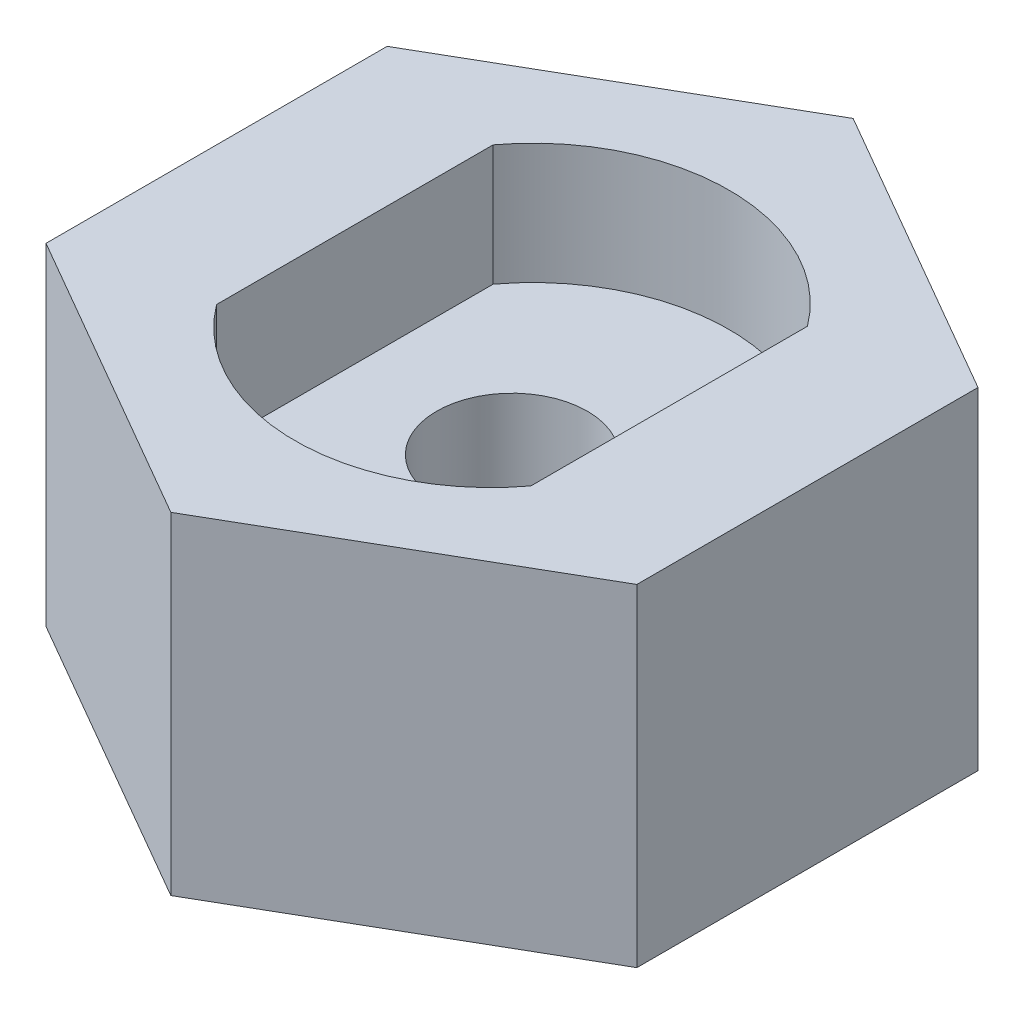
ISO-10303-21;
HEADER;
FILE_DESCRIPTION(('STEP AP214'),'2;1');
FILE_NAME('part.step','',(''),(''),'','','');
FILE_SCHEMA(('AUTOMOTIVE_DESIGN { 1 0 10303 214 1 1 1 1 }'));
ENDSEC;
DATA;
#1=APPLICATION_CONTEXT('core data for automotive mechanical design processes');
#2=APPLICATION_PROTOCOL_DEFINITION('international standard','automotive_design',2000,#1);
#3=PRODUCT_CONTEXT('',#1,'mechanical');
#4=PRODUCT('Part','Part','',(#3));
#5=PRODUCT_RELATED_PRODUCT_CATEGORY('part','',(#4));
#6=PRODUCT_DEFINITION_FORMATION('','',#4);
#7=PRODUCT_DEFINITION_CONTEXT('part definition',#1,'design');
#8=PRODUCT_DEFINITION('design','',#6,#7);
#9=PRODUCT_DEFINITION_SHAPE('','',#8);
#10=(LENGTH_UNIT() NAMED_UNIT(*) SI_UNIT(.MILLI.,.METRE.));
#11=(NAMED_UNIT(*) PLANE_ANGLE_UNIT() SI_UNIT($,.RADIAN.));
#12=(NAMED_UNIT(*) SI_UNIT($,.STERADIAN.) SOLID_ANGLE_UNIT());
#13=UNCERTAINTY_MEASURE_WITH_UNIT(LENGTH_MEASURE(1.E-05),#10,'distance_accuracy_value','');
#14=(GEOMETRIC_REPRESENTATION_CONTEXT(3) GLOBAL_UNCERTAINTY_ASSIGNED_CONTEXT((#13)) GLOBAL_UNIT_ASSIGNED_CONTEXT((#10,
#11,#12)) REPRESENTATION_CONTEXT('',''));
#15=CARTESIAN_POINT('',(0.,0.,0.));
#16=DIRECTION('',(0.,0.,1.));
#17=DIRECTION('',(1.,0.,0.));
#18=AXIS2_PLACEMENT_3D('',#15,#16,#17);
#19=CARTESIAN_POINT('',(0.,6.6,0.));
#20=DIRECTION('',(0.,-1.,0.));
#21=DIRECTION('',(0.,0.,-1.));
#22=AXIS2_PLACEMENT_3D('',#19,#20,#21);
#23=PLANE('',#22);
#24=DIRECTION('',(-0.866025403784439,0.,0.5));
#25=VECTOR('',#24,1.);
#26=CARTESIAN_POINT('',(-5.875,6.6,-3.39193283148905));
#27=LINE('',#26,#25);
#28=CARTESIAN_POINT('',(0.,6.6,-6.7838656629781));
#29=VERTEX_POINT('',#28);
#30=CARTESIAN_POINT('',(-5.875,6.6,-3.39193283148905));
#31=VERTEX_POINT('',#30);
#32=EDGE_CURVE('E159',#29,#31,#27,.T.);
#33=ORIENTED_EDGE('',*,*,#32,.T.);
#34=DIRECTION('',(0.,0.,1.));
#35=VECTOR('',#34,1.);
#36=CARTESIAN_POINT('',(-5.875,6.6,-3.39193283148905));
#37=LINE('',#36,#35);
#38=CARTESIAN_POINT('',(-5.875,6.6,3.39193283148905));
#39=VERTEX_POINT('',#38);
#40=EDGE_CURVE('E99',#31,#39,#37,.T.);
#41=ORIENTED_EDGE('',*,*,#40,.T.);
#42=DIRECTION('',(0.866025403784439,0.,0.5));
#43=VECTOR('',#42,1.);
#44=CARTESIAN_POINT('',(-5.875,6.6,3.39193283148905));
#45=LINE('',#44,#43);
#46=CARTESIAN_POINT('',(0.,6.6,6.7838656629781));
#47=VERTEX_POINT('',#46);
#48=EDGE_CURVE('E116',#39,#47,#45,.T.);
#49=ORIENTED_EDGE('',*,*,#48,.T.);
#50=DIRECTION('',(0.866025403784439,0.,-0.5));
#51=VECTOR('',#50,1.);
#52=CARTESIAN_POINT('',(0.,6.6,6.7838656629781));
#53=LINE('',#52,#51);
#54=CARTESIAN_POINT('',(5.875,6.6,3.39193283148905));
#55=VERTEX_POINT('',#54);
#56=EDGE_CURVE('E109',#47,#55,#53,.T.);
#57=ORIENTED_EDGE('',*,*,#56,.T.);
#58=DIRECTION('',(0.,0.,-1.));
#59=VECTOR('',#58,1.);
#60=CARTESIAN_POINT('',(5.875,6.6,-3.39193283148905));
#61=LINE('',#60,#59);
#62=CARTESIAN_POINT('',(5.875,6.6,-3.39193283148905));
#63=VERTEX_POINT('',#62);
#64=EDGE_CURVE('E113',#55,#63,#61,.T.);
#65=ORIENTED_EDGE('',*,*,#64,.T.);
#66=DIRECTION('',(-0.866025403784439,0.,-0.5));
#67=VECTOR('',#66,1.);
#68=CARTESIAN_POINT('',(0.,6.6,-6.7838656629781));
#69=LINE('',#68,#67);
#70=EDGE_CURVE('E64',#63,#29,#69,.T.);
#71=ORIENTED_EDGE('',*,*,#70,.T.);
#72=EDGE_LOOP('',(#33,#41,#49,#57,#65,#71));
#73=FACE_BOUND('',#72,.T.);
#74=CARTESIAN_POINT('',(0.,6.6,-0.4166815476665));
#75=DIRECTION('',(0.,-1.,0.));
#76=DIRECTION('',(0.,0.,-1.));
#77=AXIS2_PLACEMENT_3D('',#74,#75,#76);
#78=CIRCLE('',#77,3.9);
#79=CARTESIAN_POINT('',(-3.125,6.6,-2.75));
#80=VERTEX_POINT('',#79);
#81=CARTESIAN_POINT('',(3.125,6.6,-2.75));
#82=VERTEX_POINT('',#81);
#83=EDGE_CURVE('E55',#80,#82,#78,.T.);
#84=ORIENTED_EDGE('',*,*,#83,.T.);
#85=DIRECTION('',(0.,0.,1.));
#86=VECTOR('',#85,1.);
#87=CARTESIAN_POINT('',(3.125,6.6,-2.75));
#88=LINE('',#87,#86);
#89=CARTESIAN_POINT('',(3.125,6.6,2.75));
#90=VERTEX_POINT('',#89);
#91=EDGE_CURVE('E206',#82,#90,#88,.T.);
#92=ORIENTED_EDGE('',*,*,#91,.T.);
#93=CARTESIAN_POINT('',(0.,6.6,0.416681547666501));
#94=DIRECTION('',(0.,1.,0.));
#95=DIRECTION('',(0.,0.,1.));
#96=AXIS2_PLACEMENT_3D('',#93,#94,#95);
#97=CIRCLE('',#96,3.9);
#98=CARTESIAN_POINT('',(-3.125,6.6,2.75));
#99=VERTEX_POINT('',#98);
#100=EDGE_CURVE('E202',#99,#90,#97,.T.);
#101=ORIENTED_EDGE('',*,*,#100,.F.);
#102=DIRECTION('',(0.,0.,1.));
#103=VECTOR('',#102,1.);
#104=CARTESIAN_POINT('',(-3.125,6.6,-2.75));
#105=LINE('',#104,#103);
#106=EDGE_CURVE('E197',#80,#99,#105,.T.);
#107=ORIENTED_EDGE('',*,*,#106,.F.);
#108=EDGE_LOOP('',(#84,#92,#101,#107));
#109=FACE_BOUND('',#108,.T.);
#110=ADVANCED_FACE('F39',(#73,#109),#23,.F.);
#111=CARTESIAN_POINT('',(-5.875,6.6,-3.39193283148905));
#112=DIRECTION('',(0.5,0.,0.866025403784439));
#113=DIRECTION('',(0.866025403784439,0.,-0.5));
#114=AXIS2_PLACEMENT_3D('',#111,#112,#113);
#115=PLANE('',#114);
#116=DIRECTION('',(-0.866025403784439,0.,0.5));
#117=VECTOR('',#116,1.);
#118=CARTESIAN_POINT('',(-5.875,0.,-3.39193283148905));
#119=LINE('',#118,#117);
#120=CARTESIAN_POINT('',(0.,0.,-6.7838656629781));
#121=VERTEX_POINT('',#120);
#122=CARTESIAN_POINT('',(-5.875,0.,-3.39193283148905));
#123=VERTEX_POINT('',#122);
#124=EDGE_CURVE('E141',#121,#123,#119,.T.);
#125=ORIENTED_EDGE('',*,*,#124,.T.);
#126=DIRECTION('',(0.,-1.,0.));
#127=VECTOR('',#126,1.);
#128=CARTESIAN_POINT('',(-5.875,6.6,-3.39193283148905));
#129=LINE('',#128,#127);
#130=EDGE_CURVE('E11',#31,#123,#129,.T.);
#131=ORIENTED_EDGE('',*,*,#130,.F.);
#132=ORIENTED_EDGE('',*,*,#32,.F.);
#133=DIRECTION('',(0.,-1.,0.));
#134=VECTOR('',#133,1.);
#135=CARTESIAN_POINT('',(0.,6.6,-6.7838656629781));
#136=LINE('',#135,#134);
#137=EDGE_CURVE('E137',#29,#121,#136,.T.);
#138=ORIENTED_EDGE('',*,*,#137,.T.);
#139=EDGE_LOOP('',(#125,#131,#132,#138));
#140=FACE_BOUND('',#139,.T.);
#141=ADVANCED_FACE('F41',(#140),#115,.F.);
#142=CARTESIAN_POINT('',(-5.875,6.6,-3.39193283148905));
#143=DIRECTION('',(1.,0.,0.));
#144=DIRECTION('',(0.,0.,-1.));
#145=AXIS2_PLACEMENT_3D('',#142,#143,#144);
#146=PLANE('',#145);
#147=DIRECTION('',(0.,0.,1.));
#148=VECTOR('',#147,1.);
#149=CARTESIAN_POINT('',(-5.875,0.,-3.39193283148905));
#150=LINE('',#149,#148);
#151=CARTESIAN_POINT('',(-5.875,0.,3.39193283148905));
#152=VERTEX_POINT('',#151);
#153=EDGE_CURVE('E145',#123,#152,#150,.T.);
#154=ORIENTED_EDGE('',*,*,#153,.T.);
#155=DIRECTION('',(0.,-1.,0.));
#156=VECTOR('',#155,1.);
#157=CARTESIAN_POINT('',(-5.875,6.6,3.39193283148905));
#158=LINE('',#157,#156);
#159=EDGE_CURVE('E48',#39,#152,#158,.T.);
#160=ORIENTED_EDGE('',*,*,#159,.F.);
#161=ORIENTED_EDGE('',*,*,#40,.F.);
#162=ORIENTED_EDGE('',*,*,#130,.T.);
#163=EDGE_LOOP('',(#154,#160,#161,#162));
#164=FACE_BOUND('',#163,.T.);
#165=ADVANCED_FACE('F253',(#164),#146,.F.);
#166=CARTESIAN_POINT('',(-5.875,6.6,3.39193283148905));
#167=DIRECTION('',(0.5,0.,-0.866025403784439));
#168=DIRECTION('',(-0.866025403784439,0.,-0.5));
#169=AXIS2_PLACEMENT_3D('',#166,#167,#168);
#170=PLANE('',#169);
#171=DIRECTION('',(0.866025403784439,0.,0.5));
#172=VECTOR('',#171,1.);
#173=CARTESIAN_POINT('',(-5.875,0.,3.39193283148905));
#174=LINE('',#173,#172);
#175=CARTESIAN_POINT('',(0.,0.,6.7838656629781));
#176=VERTEX_POINT('',#175);
#177=EDGE_CURVE('E149',#152,#176,#174,.T.);
#178=ORIENTED_EDGE('',*,*,#177,.T.);
#179=DIRECTION('',(0.,-1.,0.));
#180=VECTOR('',#179,1.);
#181=CARTESIAN_POINT('',(0.,6.6,6.7838656629781));
#182=LINE('',#181,#180);
#183=EDGE_CURVE('E130',#47,#176,#182,.T.);
#184=ORIENTED_EDGE('',*,*,#183,.F.);
#185=ORIENTED_EDGE('',*,*,#48,.F.);
#186=ORIENTED_EDGE('',*,*,#159,.T.);
#187=EDGE_LOOP('',(#178,#184,#185,#186));
#188=FACE_BOUND('',#187,.T.);
#189=ADVANCED_FACE('F169',(#188),#170,.F.);
#190=CARTESIAN_POINT('',(0.,6.6,6.7838656629781));
#191=DIRECTION('',(-0.5,0.,-0.866025403784439));
#192=DIRECTION('',(-0.866025403784439,0.,0.5));
#193=AXIS2_PLACEMENT_3D('',#190,#191,#192);
#194=PLANE('',#193);
#195=DIRECTION('',(0.866025403784439,0.,-0.5));
#196=VECTOR('',#195,1.);
#197=CARTESIAN_POINT('',(0.,0.,6.7838656629781));
#198=LINE('',#197,#196);
#199=CARTESIAN_POINT('',(5.875,0.,3.39193283148905));
#200=VERTEX_POINT('',#199);
#201=EDGE_CURVE('E126',#176,#200,#198,.T.);
#202=ORIENTED_EDGE('',*,*,#201,.T.);
#203=DIRECTION('',(0.,-1.,0.));
#204=VECTOR('',#203,1.);
#205=CARTESIAN_POINT('',(5.875,6.6,3.39193283148905));
#206=LINE('',#205,#204);
#207=EDGE_CURVE('E123',#55,#200,#206,.T.);
#208=ORIENTED_EDGE('',*,*,#207,.F.);
#209=ORIENTED_EDGE('',*,*,#56,.F.);
#210=ORIENTED_EDGE('',*,*,#183,.T.);
#211=EDGE_LOOP('',(#202,#208,#209,#210));
#212=FACE_BOUND('',#211,.T.);
#213=ADVANCED_FACE('F124',(#212),#194,.F.);
#214=CARTESIAN_POINT('',(5.875,6.6,-3.39193283148905));
#215=DIRECTION('',(-1.,0.,0.));
#216=DIRECTION('',(0.,0.,1.));
#217=AXIS2_PLACEMENT_3D('',#214,#215,#216);
#218=PLANE('',#217);
#219=DIRECTION('',(0.,0.,-1.));
#220=VECTOR('',#219,1.);
#221=CARTESIAN_POINT('',(5.875,0.,-3.39193283148905));
#222=LINE('',#221,#220);
#223=CARTESIAN_POINT('',(5.875,0.,-3.39193283148905));
#224=VERTEX_POINT('',#223);
#225=EDGE_CURVE('E154',#200,#224,#222,.T.);
#226=ORIENTED_EDGE('',*,*,#225,.T.);
#227=DIRECTION('',(0.,-1.,0.));
#228=VECTOR('',#227,1.);
#229=CARTESIAN_POINT('',(5.875,6.6,-3.39193283148905));
#230=LINE('',#229,#228);
#231=EDGE_CURVE('E131',#63,#224,#230,.T.);
#232=ORIENTED_EDGE('',*,*,#231,.F.);
#233=ORIENTED_EDGE('',*,*,#64,.F.);
#234=ORIENTED_EDGE('',*,*,#207,.T.);
#235=EDGE_LOOP('',(#226,#232,#233,#234));
#236=FACE_BOUND('',#235,.T.);
#237=ADVANCED_FACE('F133',(#236),#218,.F.);
#238=CARTESIAN_POINT('',(0.,6.6,-6.7838656629781));
#239=DIRECTION('',(-0.5,0.,0.866025403784439));
#240=DIRECTION('',(0.866025403784439,0.,0.5));
#241=AXIS2_PLACEMENT_3D('',#238,#239,#240);
#242=PLANE('',#241);
#243=DIRECTION('',(-0.866025403784439,0.,-0.5));
#244=VECTOR('',#243,1.);
#245=CARTESIAN_POINT('',(0.,0.,-6.7838656629781));
#246=LINE('',#245,#244);
#247=EDGE_CURVE('E91',#224,#121,#246,.T.);
#248=ORIENTED_EDGE('',*,*,#247,.T.);
#249=ORIENTED_EDGE('',*,*,#137,.F.);
#250=ORIENTED_EDGE('',*,*,#70,.F.);
#251=ORIENTED_EDGE('',*,*,#231,.T.);
#252=EDGE_LOOP('',(#248,#249,#250,#251));
#253=FACE_BOUND('',#252,.T.);
#254=ADVANCED_FACE('F173',(#253),#242,.F.);
#255=CARTESIAN_POINT('',(0.,0.,0.));
#256=DIRECTION('',(0.,-1.,0.));
#257=DIRECTION('',(0.,0.,-1.));
#258=AXIS2_PLACEMENT_3D('',#255,#256,#257);
#259=PLANE('',#258);
#260=CARTESIAN_POINT('',(0.,0.,0.));
#261=DIRECTION('',(0.,-1.,0.));
#262=DIRECTION('',(0.,0.,-1.));
#263=AXIS2_PLACEMENT_3D('',#260,#261,#262);
#264=CIRCLE('',#263,1.5);
#265=CARTESIAN_POINT('',(0.,0.,-1.5));
#266=VERTEX_POINT('',#265);
#267=EDGE_CURVE('E230',#266,#266,#264,.T.);
#268=ORIENTED_EDGE('',*,*,#267,.F.);
#269=EDGE_LOOP('',(#268));
#270=FACE_BOUND('',#269,.T.);
#271=ORIENTED_EDGE('',*,*,#124,.F.);
#272=ORIENTED_EDGE('',*,*,#247,.F.);
#273=ORIENTED_EDGE('',*,*,#225,.F.);
#274=ORIENTED_EDGE('',*,*,#201,.F.);
#275=ORIENTED_EDGE('',*,*,#177,.F.);
#276=ORIENTED_EDGE('',*,*,#153,.F.);
#277=EDGE_LOOP('',(#271,#272,#273,#274,#275,#276));
#278=FACE_BOUND('',#277,.T.);
#279=ADVANCED_FACE('F172',(#270,#278),#259,.T.);
#280=CARTESIAN_POINT('',(0.,4.2,-0.4166815476665));
#281=DIRECTION('',(0.,1.,0.));
#282=DIRECTION('',(0.,0.,1.));
#283=AXIS2_PLACEMENT_3D('',#280,#281,#282);
#284=CYLINDRICAL_SURFACE('',#283,3.9);
#285=ORIENTED_EDGE('',*,*,#83,.F.);
#286=DIRECTION('',(0.,1.,0.));
#287=VECTOR('',#286,1.);
#288=CARTESIAN_POINT('',(-3.125,4.2,-2.75));
#289=LINE('',#288,#287);
#290=CARTESIAN_POINT('',(-3.125,4.2,-2.75));
#291=VERTEX_POINT('',#290);
#292=EDGE_CURVE('E193',#291,#80,#289,.T.);
#293=ORIENTED_EDGE('',*,*,#292,.F.);
#294=CARTESIAN_POINT('',(0.,4.2,-0.4166815476665));
#295=DIRECTION('',(0.,-1.,0.));
#296=DIRECTION('',(0.,0.,-1.));
#297=AXIS2_PLACEMENT_3D('',#294,#295,#296);
#298=CIRCLE('',#297,3.9);
#299=CARTESIAN_POINT('',(3.125,4.2,-2.75));
#300=VERTEX_POINT('',#299);
#301=EDGE_CURVE('E201',#291,#300,#298,.T.);
#302=ORIENTED_EDGE('',*,*,#301,.T.);
#303=DIRECTION('',(0.,1.,0.));
#304=VECTOR('',#303,1.);
#305=CARTESIAN_POINT('',(3.125,4.2,-2.75));
#306=LINE('',#305,#304);
#307=EDGE_CURVE('E146',#300,#82,#306,.T.);
#308=ORIENTED_EDGE('',*,*,#307,.T.);
#309=EDGE_LOOP('',(#285,#293,#302,#308));
#310=FACE_BOUND('',#309,.T.);
#311=ADVANCED_FACE('F239',(#310),#284,.F.);
#312=CARTESIAN_POINT('',(3.125,4.2,-2.75));
#313=DIRECTION('',(-1.,0.,0.));
#314=DIRECTION('',(0.,0.,1.));
#315=AXIS2_PLACEMENT_3D('',#312,#313,#314);
#316=PLANE('',#315);
#317=ORIENTED_EDGE('',*,*,#91,.F.);
#318=ORIENTED_EDGE('',*,*,#307,.F.);
#319=DIRECTION('',(0.,0.,1.));
#320=VECTOR('',#319,1.);
#321=CARTESIAN_POINT('',(3.125,4.2,-2.75));
#322=LINE('',#321,#320);
#323=CARTESIAN_POINT('',(3.125,4.2,2.75));
#324=VERTEX_POINT('',#323);
#325=EDGE_CURVE('E220',#300,#324,#322,.T.);
#326=ORIENTED_EDGE('',*,*,#325,.T.);
#327=DIRECTION('',(0.,1.,0.));
#328=VECTOR('',#327,1.);
#329=CARTESIAN_POINT('',(3.125,4.2,2.75));
#330=LINE('',#329,#328);
#331=EDGE_CURVE('E185',#324,#90,#330,.T.);
#332=ORIENTED_EDGE('',*,*,#331,.T.);
#333=EDGE_LOOP('',(#317,#318,#326,#332));
#334=FACE_BOUND('',#333,.T.);
#335=ADVANCED_FACE('F245',(#334),#316,.T.);
#336=CARTESIAN_POINT('',(0.,4.2,0.416681547666501));
#337=DIRECTION('',(0.,1.,0.));
#338=DIRECTION('',(0.,0.,1.));
#339=AXIS2_PLACEMENT_3D('',#336,#337,#338);
#340=CYLINDRICAL_SURFACE('',#339,3.9);
#341=ORIENTED_EDGE('',*,*,#100,.T.);
#342=ORIENTED_EDGE('',*,*,#331,.F.);
#343=CARTESIAN_POINT('',(0.,4.2,0.416681547666501));
#344=DIRECTION('',(0.,1.,0.));
#345=DIRECTION('',(0.,0.,1.));
#346=AXIS2_PLACEMENT_3D('',#343,#344,#345);
#347=CIRCLE('',#346,3.9);
#348=CARTESIAN_POINT('',(-3.125,4.2,2.75));
#349=VERTEX_POINT('',#348);
#350=EDGE_CURVE('E216',#349,#324,#347,.T.);
#351=ORIENTED_EDGE('',*,*,#350,.F.);
#352=DIRECTION('',(0.,1.,0.));
#353=VECTOR('',#352,1.);
#354=CARTESIAN_POINT('',(-3.125,4.2,2.75));
#355=LINE('',#354,#353);
#356=EDGE_CURVE('E189',#349,#99,#355,.T.);
#357=ORIENTED_EDGE('',*,*,#356,.T.);
#358=EDGE_LOOP('',(#341,#342,#351,#357));
#359=FACE_BOUND('',#358,.T.);
#360=ADVANCED_FACE('F257',(#359),#340,.F.);
#361=CARTESIAN_POINT('',(-3.125,4.2,-2.75));
#362=DIRECTION('',(-1.,0.,0.));
#363=DIRECTION('',(0.,0.,1.));
#364=AXIS2_PLACEMENT_3D('',#361,#362,#363);
#365=PLANE('',#364);
#366=ORIENTED_EDGE('',*,*,#106,.T.);
#367=ORIENTED_EDGE('',*,*,#356,.F.);
#368=DIRECTION('',(0.,0.,1.));
#369=VECTOR('',#368,1.);
#370=CARTESIAN_POINT('',(-3.125,4.2,-2.75));
#371=LINE('',#370,#369);
#372=EDGE_CURVE('E196',#291,#349,#371,.T.);
#373=ORIENTED_EDGE('',*,*,#372,.F.);
#374=ORIENTED_EDGE('',*,*,#292,.T.);
#375=EDGE_LOOP('',(#366,#367,#373,#374));
#376=FACE_BOUND('',#375,.T.);
#377=ADVANCED_FACE('F261',(#376),#365,.F.);
#378=CARTESIAN_POINT('',(0.,4.2,-0.4166815476665));
#379=DIRECTION('',(0.,-1.,0.));
#380=DIRECTION('',(0.,0.,-1.));
#381=AXIS2_PLACEMENT_3D('',#378,#379,#380);
#382=PLANE('',#381);
#383=CARTESIAN_POINT('',(0.,4.2,0.));
#384=DIRECTION('',(0.,-1.,0.));
#385=DIRECTION('',(0.,0.,-1.));
#386=AXIS2_PLACEMENT_3D('',#383,#384,#385);
#387=CIRCLE('',#386,1.5);
#388=CARTESIAN_POINT('',(0.,4.2,-1.5));
#389=VERTEX_POINT('',#388);
#390=EDGE_CURVE('E212',#389,#389,#387,.T.);
#391=ORIENTED_EDGE('',*,*,#390,.T.);
#392=EDGE_LOOP('',(#391));
#393=FACE_BOUND('',#392,.T.);
#394=ORIENTED_EDGE('',*,*,#301,.F.);
#395=ORIENTED_EDGE('',*,*,#372,.T.);
#396=ORIENTED_EDGE('',*,*,#350,.T.);
#397=ORIENTED_EDGE('',*,*,#325,.F.);
#398=EDGE_LOOP('',(#394,#395,#396,#397));
#399=FACE_BOUND('',#398,.T.);
#400=ADVANCED_FACE('F265',(#393,#399),#382,.F.);
#401=CARTESIAN_POINT('',(0.,0.,0.));
#402=DIRECTION('',(0.,-1.,0.));
#403=DIRECTION('',(0.,0.,-1.));
#404=AXIS2_PLACEMENT_3D('',#401,#402,#403);
#405=CYLINDRICAL_SURFACE('',#404,1.5);
#406=ORIENTED_EDGE('',*,*,#267,.T.);
#407=EDGE_LOOP('',(#406));
#408=FACE_BOUND('',#407,.T.);
#409=ORIENTED_EDGE('',*,*,#390,.F.);
#410=EDGE_LOOP('',(#409));
#411=FACE_BOUND('',#410,.T.);
#412=ADVANCED_FACE('F235',(#408,#411),#405,.F.);
#413=CLOSED_SHELL('',(#110,#141,#165,#189,#213,#237,#254,#279,#311,#335,#360,#377,#400,#412));
#414=MANIFOLD_SOLID_BREP('B2',#413);
#415=ADVANCED_BREP_SHAPE_REPRESENTATION('',(#18,#414),#14);
#416=SHAPE_DEFINITION_REPRESENTATION(#9,#415);
ENDSEC;
END-ISO-10303-21;
